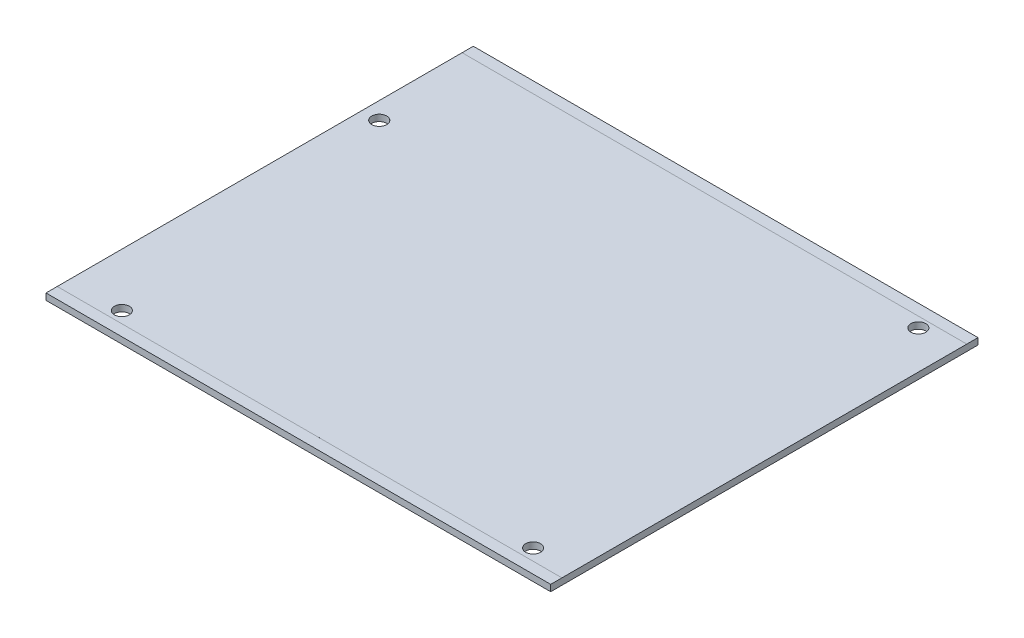
ISO-10303-21;
HEADER;
FILE_DESCRIPTION(('STEP AP214'),'2;1');
FILE_NAME('part.step','',(''),(''),'','','');
FILE_SCHEMA(('AUTOMOTIVE_DESIGN { 1 0 10303 214 1 1 1 1 }'));
ENDSEC;
DATA;
#1=APPLICATION_CONTEXT('core data for automotive mechanical design processes');
#2=APPLICATION_PROTOCOL_DEFINITION('international standard','automotive_design',2000,#1);
#3=PRODUCT_CONTEXT('',#1,'mechanical');
#4=PRODUCT('Part','Part','',(#3));
#5=PRODUCT_RELATED_PRODUCT_CATEGORY('part','',(#4));
#6=PRODUCT_DEFINITION_FORMATION('','',#4);
#7=PRODUCT_DEFINITION_CONTEXT('part definition',#1,'design');
#8=PRODUCT_DEFINITION('design','',#6,#7);
#9=PRODUCT_DEFINITION_SHAPE('','',#8);
#10=(LENGTH_UNIT() NAMED_UNIT(*) SI_UNIT(.MILLI.,.METRE.));
#11=(NAMED_UNIT(*) PLANE_ANGLE_UNIT() SI_UNIT($,.RADIAN.));
#12=(NAMED_UNIT(*) SI_UNIT($,.STERADIAN.) SOLID_ANGLE_UNIT());
#13=UNCERTAINTY_MEASURE_WITH_UNIT(LENGTH_MEASURE(1.E-05),#10,'distance_accuracy_value','');
#14=(GEOMETRIC_REPRESENTATION_CONTEXT(3) GLOBAL_UNCERTAINTY_ASSIGNED_CONTEXT((#13)) GLOBAL_UNIT_ASSIGNED_CONTEXT((#10,
#11,#12)) REPRESENTATION_CONTEXT('',''));
#15=CARTESIAN_POINT('',(0.,0.,0.));
#16=DIRECTION('',(0.,0.,1.));
#17=DIRECTION('',(1.,0.,0.));
#18=AXIS2_PLACEMENT_3D('',#15,#16,#17);
#19=CARTESIAN_POINT('',(-67.5,1.724,-57.15));
#20=DIRECTION('',(0.,0.,1.));
#21=DIRECTION('',(1.,0.,0.));
#22=AXIS2_PLACEMENT_3D('',#19,#20,#21);
#23=PLANE('',#22);
#24=DIRECTION('',(-1.,0.,0.));
#25=VECTOR('',#24,1.);
#26=CARTESIAN_POINT('',(-67.5,1.7239,-57.15));
#27=LINE('',#26,#25);
#28=CARTESIAN_POINT('',(67.5,1.7239,-57.15));
#29=VERTEX_POINT('',#28);
#30=CARTESIAN_POINT('',(-67.5,1.7239,-57.15));
#31=VERTEX_POINT('',#30);
#32=EDGE_CURVE('E140',#29,#31,#27,.T.);
#33=ORIENTED_EDGE('',*,*,#32,.F.);
#34=DIRECTION('',(0.,-1.,0.));
#35=VECTOR('',#34,1.);
#36=CARTESIAN_POINT('',(67.5,1.724,-57.15));
#37=LINE('',#36,#35);
#38=CARTESIAN_POINT('',(67.5,0.,-57.15));
#39=VERTEX_POINT('',#38);
#40=EDGE_CURVE('E11',#29,#39,#37,.T.);
#41=ORIENTED_EDGE('',*,*,#40,.T.);
#42=DIRECTION('',(-1.,0.,0.));
#43=VECTOR('',#42,1.);
#44=CARTESIAN_POINT('',(-67.5,0.,-57.15));
#45=LINE('',#44,#43);
#46=CARTESIAN_POINT('',(-67.5,0.,-57.15));
#47=VERTEX_POINT('',#46);
#48=EDGE_CURVE('E129',#39,#47,#45,.T.);
#49=ORIENTED_EDGE('',*,*,#48,.T.);
#50=DIRECTION('',(0.,-1.,0.));
#51=VECTOR('',#50,1.);
#52=CARTESIAN_POINT('',(-67.5,1.724,-57.15));
#53=LINE('',#52,#51);
#54=EDGE_CURVE('E39',#31,#47,#53,.T.);
#55=ORIENTED_EDGE('',*,*,#54,.F.);
#56=EDGE_LOOP('',(#33,#41,#49,#55));
#57=FACE_BOUND('',#56,.T.);
#58=ADVANCED_FACE('F31',(#57),#23,.F.);
#59=CARTESIAN_POINT('',(67.5,1.724,57.15));
#60=DIRECTION('',(-1.,0.,0.));
#61=DIRECTION('',(0.,0.,1.));
#62=AXIS2_PLACEMENT_3D('',#59,#60,#61);
#63=PLANE('',#62);
#64=DIRECTION('',(0.,0.,-1.));
#65=VECTOR('',#64,1.);
#66=CARTESIAN_POINT('',(67.5,1.724,57.15));
#67=LINE('',#66,#65);
#68=CARTESIAN_POINT('',(67.5,1.724,54.15));
#69=VERTEX_POINT('',#68);
#70=CARTESIAN_POINT('',(67.5,1.724,-54.15));
#71=VERTEX_POINT('',#70);
#72=EDGE_CURVE('E127',#69,#71,#67,.T.);
#73=ORIENTED_EDGE('',*,*,#72,.F.);
#74=DIRECTION('',(0.,1.,0.));
#75=VECTOR('',#74,1.);
#76=CARTESIAN_POINT('',(67.5,1.7239,54.15));
#77=LINE('',#76,#75);
#78=CARTESIAN_POINT('',(67.5,1.7239,54.15));
#79=VERTEX_POINT('',#78);
#80=EDGE_CURVE('E46',#79,#69,#77,.T.);
#81=ORIENTED_EDGE('',*,*,#80,.F.);
#82=DIRECTION('',(0.,0.,-1.));
#83=VECTOR('',#82,1.);
#84=CARTESIAN_POINT('',(67.5,1.7239,57.15));
#85=LINE('',#84,#83);
#86=CARTESIAN_POINT('',(67.5,1.7239,57.15));
#87=VERTEX_POINT('',#86);
#88=EDGE_CURVE('E115',#87,#79,#85,.T.);
#89=ORIENTED_EDGE('',*,*,#88,.F.);
#90=DIRECTION('',(0.,-1.,0.));
#91=VECTOR('',#90,1.);
#92=CARTESIAN_POINT('',(67.5,1.724,57.15));
#93=LINE('',#92,#91);
#94=CARTESIAN_POINT('',(67.5,0.,57.15));
#95=VERTEX_POINT('',#94);
#96=EDGE_CURVE('E114',#87,#95,#93,.T.);
#97=ORIENTED_EDGE('',*,*,#96,.T.);
#98=DIRECTION('',(0.,0.,-1.));
#99=VECTOR('',#98,1.);
#100=CARTESIAN_POINT('',(67.5,0.,57.15));
#101=LINE('',#100,#99);
#102=EDGE_CURVE('E132',#95,#39,#101,.T.);
#103=ORIENTED_EDGE('',*,*,#102,.T.);
#104=ORIENTED_EDGE('',*,*,#40,.F.);
#105=DIRECTION('',(0.,0.,-1.));
#106=VECTOR('',#105,1.);
#107=CARTESIAN_POINT('',(67.5,1.7239,-57.15));
#108=LINE('',#107,#106);
#109=CARTESIAN_POINT('',(67.5,1.7239,-54.15));
#110=VERTEX_POINT('',#109);
#111=EDGE_CURVE('E148',#110,#29,#108,.T.);
#112=ORIENTED_EDGE('',*,*,#111,.F.);
#113=DIRECTION('',(0.,1.,0.));
#114=VECTOR('',#113,1.);
#115=CARTESIAN_POINT('',(67.5,1.7239,-54.15));
#116=LINE('',#115,#114);
#117=EDGE_CURVE('E135',#110,#71,#116,.T.);
#118=ORIENTED_EDGE('',*,*,#117,.T.);
#119=EDGE_LOOP('',(#73,#81,#89,#97,#103,#104,#112,#118));
#120=FACE_BOUND('',#119,.T.);
#121=ADVANCED_FACE('F33',(#120),#63,.F.);
#122=CARTESIAN_POINT('',(-67.5,1.724,57.15));
#123=DIRECTION('',(1.,0.,0.));
#124=DIRECTION('',(0.,0.,-1.));
#125=AXIS2_PLACEMENT_3D('',#122,#123,#124);
#126=PLANE('',#125);
#127=DIRECTION('',(0.,0.,1.));
#128=VECTOR('',#127,1.);
#129=CARTESIAN_POINT('',(-67.5,1.7239,57.15));
#130=LINE('',#129,#128);
#131=CARTESIAN_POINT('',(-67.5,1.7239,54.15));
#132=VERTEX_POINT('',#131);
#133=CARTESIAN_POINT('',(-67.5,1.7239,57.15));
#134=VERTEX_POINT('',#133);
#135=EDGE_CURVE('E97',#132,#134,#130,.T.);
#136=ORIENTED_EDGE('',*,*,#135,.F.);
#137=DIRECTION('',(0.,1.,0.));
#138=VECTOR('',#137,1.);
#139=CARTESIAN_POINT('',(-67.5,1.7239,54.15));
#140=LINE('',#139,#138);
#141=CARTESIAN_POINT('',(-67.5,1.724,54.15));
#142=VERTEX_POINT('',#141);
#143=EDGE_CURVE('E146',#132,#142,#140,.T.);
#144=ORIENTED_EDGE('',*,*,#143,.T.);
#145=DIRECTION('',(0.,0.,1.));
#146=VECTOR('',#145,1.);
#147=CARTESIAN_POINT('',(-67.5,1.724,57.15));
#148=LINE('',#147,#146);
#149=CARTESIAN_POINT('',(-67.5,1.724,-54.15));
#150=VERTEX_POINT('',#149);
#151=EDGE_CURVE('E122',#150,#142,#148,.T.);
#152=ORIENTED_EDGE('',*,*,#151,.F.);
#153=DIRECTION('',(0.,1.,0.));
#154=VECTOR('',#153,1.);
#155=CARTESIAN_POINT('',(-67.5,1.7239,-54.15));
#156=LINE('',#155,#154);
#157=CARTESIAN_POINT('',(-67.5,1.7239,-54.15));
#158=VERTEX_POINT('',#157);
#159=EDGE_CURVE('E54',#158,#150,#156,.T.);
#160=ORIENTED_EDGE('',*,*,#159,.F.);
#161=DIRECTION('',(0.,0.,1.));
#162=VECTOR('',#161,1.);
#163=CARTESIAN_POINT('',(-67.5,1.7239,-57.15));
#164=LINE('',#163,#162);
#165=EDGE_CURVE('E145',#31,#158,#164,.T.);
#166=ORIENTED_EDGE('',*,*,#165,.F.);
#167=ORIENTED_EDGE('',*,*,#54,.T.);
#168=DIRECTION('',(0.,0.,1.));
#169=VECTOR('',#168,1.);
#170=CARTESIAN_POINT('',(-67.5,0.,57.15));
#171=LINE('',#170,#169);
#172=CARTESIAN_POINT('',(-67.5,0.,57.15));
#173=VERTEX_POINT('',#172);
#174=EDGE_CURVE('E119',#47,#173,#171,.T.);
#175=ORIENTED_EDGE('',*,*,#174,.T.);
#176=DIRECTION('',(0.,-1.,0.));
#177=VECTOR('',#176,1.);
#178=CARTESIAN_POINT('',(-67.5,1.724,57.15));
#179=LINE('',#178,#177);
#180=EDGE_CURVE('E112',#134,#173,#179,.T.);
#181=ORIENTED_EDGE('',*,*,#180,.F.);
#182=EDGE_LOOP('',(#136,#144,#152,#160,#166,#167,#175,#181));
#183=FACE_BOUND('',#182,.T.);
#184=ADVANCED_FACE('F117',(#183),#126,.F.);
#185=CARTESIAN_POINT('',(-67.5,1.724,57.15));
#186=DIRECTION('',(0.,0.,-1.));
#187=DIRECTION('',(-1.,0.,0.));
#188=AXIS2_PLACEMENT_3D('',#185,#186,#187);
#189=PLANE('',#188);
#190=ORIENTED_EDGE('',*,*,#96,.F.);
#191=DIRECTION('',(1.,0.,0.));
#192=VECTOR('',#191,1.);
#193=CARTESIAN_POINT('',(-67.5,1.7239,57.15));
#194=LINE('',#193,#192);
#195=EDGE_CURVE('E100',#134,#87,#194,.T.);
#196=ORIENTED_EDGE('',*,*,#195,.F.);
#197=ORIENTED_EDGE('',*,*,#180,.T.);
#198=DIRECTION('',(1.,0.,0.));
#199=VECTOR('',#198,1.);
#200=CARTESIAN_POINT('',(-67.5,0.,57.15));
#201=LINE('',#200,#199);
#202=EDGE_CURVE('E125',#173,#95,#201,.T.);
#203=ORIENTED_EDGE('',*,*,#202,.T.);
#204=EDGE_LOOP('',(#190,#196,#197,#203));
#205=FACE_BOUND('',#204,.T.);
#206=ADVANCED_FACE('F110',(#205),#189,.F.);
#207=CARTESIAN_POINT('',(67.5,1.724,-57.15));
#208=DIRECTION('',(0.,-1.,0.));
#209=DIRECTION('',(0.,0.,-1.));
#210=AXIS2_PLACEMENT_3D('',#207,#208,#209);
#211=PLANE('',#210);
#212=CARTESIAN_POINT('',(-62.9274879110714,1.724,-27.4202383587924));
#213=DIRECTION('',(0.,-1.,0.));
#214=DIRECTION('',(0.,0.,-1.));
#215=AXIS2_PLACEMENT_3D('',#212,#213,#214);
#216=CIRCLE('',#215,2.);
#217=CARTESIAN_POINT('',(-62.9274879110714,1.724,-29.4202383587924));
#218=VERTEX_POINT('',#217);
#219=EDGE_CURVE('E176',#218,#218,#216,.T.);
#220=ORIENTED_EDGE('',*,*,#219,.T.);
#221=EDGE_LOOP('',(#220));
#222=FACE_BOUND('',#221,.T.);
#223=CARTESIAN_POINT('',(57.2725120889286,1.724,-51.4202383587924));
#224=DIRECTION('',(0.,-1.,0.));
#225=DIRECTION('',(0.,0.,-1.));
#226=AXIS2_PLACEMENT_3D('',#223,#224,#225);
#227=CIRCLE('',#226,2.);
#228=CARTESIAN_POINT('',(57.2725120889286,1.724,-53.4202383587924));
#229=VERTEX_POINT('',#228);
#230=EDGE_CURVE('E170',#229,#229,#227,.T.);
#231=ORIENTED_EDGE('',*,*,#230,.T.);
#232=EDGE_LOOP('',(#231));
#233=FACE_BOUND('',#232,.T.);
#234=CARTESIAN_POINT('',(56.7245120889286,1.724,51.0797616412076));
#235=DIRECTION('',(0.,-1.,0.));
#236=DIRECTION('',(0.,0.,-1.));
#237=AXIS2_PLACEMENT_3D('',#234,#235,#236);
#238=CIRCLE('',#237,2.);
#239=CARTESIAN_POINT('',(56.7245120889286,1.724,49.0797616412076));
#240=VERTEX_POINT('',#239);
#241=EDGE_CURVE('E164',#240,#240,#238,.T.);
#242=ORIENTED_EDGE('',*,*,#241,.T.);
#243=EDGE_LOOP('',(#242));
#244=FACE_BOUND('',#243,.T.);
#245=CARTESIAN_POINT('',(-53.2754879110714,1.724,51.0797616412077));
#246=DIRECTION('',(0.,-1.,0.));
#247=DIRECTION('',(0.,0.,-1.));
#248=AXIS2_PLACEMENT_3D('',#245,#246,#247);
#249=CIRCLE('',#248,2.);
#250=CARTESIAN_POINT('',(-53.2754879110714,1.724,49.0797616412077));
#251=VERTEX_POINT('',#250);
#252=EDGE_CURVE('E158',#251,#251,#249,.T.);
#253=ORIENTED_EDGE('',*,*,#252,.T.);
#254=EDGE_LOOP('',(#253));
#255=FACE_BOUND('',#254,.T.);
#256=ORIENTED_EDGE('',*,*,#151,.T.);
#257=DIRECTION('',(-1.,0.,0.));
#258=VECTOR('',#257,1.);
#259=CARTESIAN_POINT('',(-67.5,1.724,54.15));
#260=LINE('',#259,#258);
#261=EDGE_CURVE('E106',#69,#142,#260,.T.);
#262=ORIENTED_EDGE('',*,*,#261,.F.);
#263=ORIENTED_EDGE('',*,*,#72,.T.);
#264=DIRECTION('',(1.,0.,0.));
#265=VECTOR('',#264,1.);
#266=CARTESIAN_POINT('',(-67.5,1.724,-54.15));
#267=LINE('',#266,#265);
#268=EDGE_CURVE('E143',#150,#71,#267,.T.);
#269=ORIENTED_EDGE('',*,*,#268,.F.);
#270=EDGE_LOOP('',(#256,#262,#263,#269));
#271=FACE_BOUND('',#270,.T.);
#272=ADVANCED_FACE('F185',(#222,#233,#244,#255,#271),#211,.F.);
#273=CARTESIAN_POINT('',(67.5,0.,-57.15));
#274=DIRECTION('',(0.,-1.,0.));
#275=DIRECTION('',(0.,0.,-1.));
#276=AXIS2_PLACEMENT_3D('',#273,#274,#275);
#277=PLANE('',#276);
#278=CARTESIAN_POINT('',(-62.9274879110714,0.,-27.4202383587924));
#279=DIRECTION('',(0.,-1.,0.));
#280=DIRECTION('',(0.,0.,-1.));
#281=AXIS2_PLACEMENT_3D('',#278,#279,#280);
#282=CIRCLE('',#281,2.);
#283=CARTESIAN_POINT('',(-62.9274879110714,0.,-29.4202383587924));
#284=VERTEX_POINT('',#283);
#285=EDGE_CURVE('E179',#284,#284,#282,.T.);
#286=ORIENTED_EDGE('',*,*,#285,.F.);
#287=EDGE_LOOP('',(#286));
#288=FACE_BOUND('',#287,.T.);
#289=CARTESIAN_POINT('',(57.2725120889286,0.,-51.4202383587924));
#290=DIRECTION('',(0.,-1.,0.));
#291=DIRECTION('',(0.,0.,-1.));
#292=AXIS2_PLACEMENT_3D('',#289,#290,#291);
#293=CIRCLE('',#292,2.);
#294=CARTESIAN_POINT('',(57.2725120889286,0.,-53.4202383587924));
#295=VERTEX_POINT('',#294);
#296=EDGE_CURVE('E173',#295,#295,#293,.T.);
#297=ORIENTED_EDGE('',*,*,#296,.F.);
#298=EDGE_LOOP('',(#297));
#299=FACE_BOUND('',#298,.T.);
#300=CARTESIAN_POINT('',(56.7245120889286,0.,51.0797616412076));
#301=DIRECTION('',(0.,-1.,0.));
#302=DIRECTION('',(0.,0.,-1.));
#303=AXIS2_PLACEMENT_3D('',#300,#301,#302);
#304=CIRCLE('',#303,2.);
#305=CARTESIAN_POINT('',(56.7245120889286,0.,49.0797616412076));
#306=VERTEX_POINT('',#305);
#307=EDGE_CURVE('E167',#306,#306,#304,.T.);
#308=ORIENTED_EDGE('',*,*,#307,.F.);
#309=EDGE_LOOP('',(#308));
#310=FACE_BOUND('',#309,.T.);
#311=CARTESIAN_POINT('',(-53.2754879110714,0.,51.0797616412077));
#312=DIRECTION('',(0.,-1.,0.));
#313=DIRECTION('',(0.,0.,-1.));
#314=AXIS2_PLACEMENT_3D('',#311,#312,#313);
#315=CIRCLE('',#314,2.);
#316=CARTESIAN_POINT('',(-53.2754879110714,0.,49.0797616412077));
#317=VERTEX_POINT('',#316);
#318=EDGE_CURVE('E161',#317,#317,#315,.T.);
#319=ORIENTED_EDGE('',*,*,#318,.F.);
#320=EDGE_LOOP('',(#319));
#321=FACE_BOUND('',#320,.T.);
#322=ORIENTED_EDGE('',*,*,#102,.F.);
#323=ORIENTED_EDGE('',*,*,#202,.F.);
#324=ORIENTED_EDGE('',*,*,#174,.F.);
#325=ORIENTED_EDGE('',*,*,#48,.F.);
#326=EDGE_LOOP('',(#322,#323,#324,#325));
#327=FACE_BOUND('',#326,.T.);
#328=ADVANCED_FACE('F195',(#288,#299,#310,#321,#327),#277,.T.);
#329=CARTESIAN_POINT('',(-67.5,1.7239,-54.15));
#330=DIRECTION('',(0.,0.,1.));
#331=DIRECTION('',(1.,0.,0.));
#332=AXIS2_PLACEMENT_3D('',#329,#330,#331);
#333=PLANE('',#332);
#334=ORIENTED_EDGE('',*,*,#268,.T.);
#335=ORIENTED_EDGE('',*,*,#117,.F.);
#336=DIRECTION('',(1.,0.,0.));
#337=VECTOR('',#336,1.);
#338=CARTESIAN_POINT('',(-67.5,1.7239,-54.15));
#339=LINE('',#338,#337);
#340=EDGE_CURVE('E150',#158,#110,#339,.T.);
#341=ORIENTED_EDGE('',*,*,#340,.F.);
#342=ORIENTED_EDGE('',*,*,#159,.T.);
#343=EDGE_LOOP('',(#334,#335,#341,#342));
#344=FACE_BOUND('',#343,.T.);
#345=ADVANCED_FACE('F198',(#344),#333,.F.);
#346=CARTESIAN_POINT('',(-67.5,1.7239,-54.15));
#347=DIRECTION('',(0.,1.,0.));
#348=DIRECTION('',(0.,0.,1.));
#349=AXIS2_PLACEMENT_3D('',#346,#347,#348);
#350=PLANE('',#349);
#351=ORIENTED_EDGE('',*,*,#165,.T.);
#352=ORIENTED_EDGE('',*,*,#340,.T.);
#353=ORIENTED_EDGE('',*,*,#111,.T.);
#354=ORIENTED_EDGE('',*,*,#32,.T.);
#355=EDGE_LOOP('',(#351,#352,#353,#354));
#356=FACE_BOUND('',#355,.T.);
#357=ADVANCED_FACE('F217',(#356),#350,.T.);
#358=CARTESIAN_POINT('',(-67.5,1.7239,54.15));
#359=DIRECTION('',(0.,0.,-1.));
#360=DIRECTION('',(-1.,0.,0.));
#361=AXIS2_PLACEMENT_3D('',#358,#359,#360);
#362=PLANE('',#361);
#363=ORIENTED_EDGE('',*,*,#261,.T.);
#364=ORIENTED_EDGE('',*,*,#143,.F.);
#365=DIRECTION('',(-1.,0.,0.));
#366=VECTOR('',#365,1.);
#367=CARTESIAN_POINT('',(-67.5,1.7239,54.15));
#368=LINE('',#367,#366);
#369=EDGE_CURVE('E102',#79,#132,#368,.T.);
#370=ORIENTED_EDGE('',*,*,#369,.F.);
#371=ORIENTED_EDGE('',*,*,#80,.T.);
#372=EDGE_LOOP('',(#363,#364,#370,#371));
#373=FACE_BOUND('',#372,.T.);
#374=ADVANCED_FACE('F212',(#373),#362,.F.);
#375=CARTESIAN_POINT('',(-67.5,1.7239,54.15));
#376=DIRECTION('',(0.,-1.,0.));
#377=DIRECTION('',(0.,0.,-1.));
#378=AXIS2_PLACEMENT_3D('',#375,#376,#377);
#379=PLANE('',#378);
#380=ORIENTED_EDGE('',*,*,#135,.T.);
#381=ORIENTED_EDGE('',*,*,#195,.T.);
#382=ORIENTED_EDGE('',*,*,#88,.T.);
#383=ORIENTED_EDGE('',*,*,#369,.T.);
#384=EDGE_LOOP('',(#380,#381,#382,#383));
#385=FACE_BOUND('',#384,.T.);
#386=ADVANCED_FACE('F99',(#385),#379,.F.);
#387=CARTESIAN_POINT('',(-53.2754879110714,1.724,51.0797616412077));
#388=DIRECTION('',(0.,-1.,0.));
#389=DIRECTION('',(0.,0.,-1.));
#390=AXIS2_PLACEMENT_3D('',#387,#388,#389);
#391=CYLINDRICAL_SURFACE('',#390,2.);
#392=ORIENTED_EDGE('',*,*,#252,.F.);
#393=EDGE_LOOP('',(#392));
#394=FACE_BOUND('',#393,.T.);
#395=ORIENTED_EDGE('',*,*,#318,.T.);
#396=EDGE_LOOP('',(#395));
#397=FACE_BOUND('',#396,.T.);
#398=ADVANCED_FACE('F240',(#394,#397),#391,.F.);
#399=CARTESIAN_POINT('',(56.7245120889286,1.724,51.0797616412076));
#400=DIRECTION('',(0.,-1.,0.));
#401=DIRECTION('',(0.,0.,-1.));
#402=AXIS2_PLACEMENT_3D('',#399,#400,#401);
#403=CYLINDRICAL_SURFACE('',#402,2.);
#404=ORIENTED_EDGE('',*,*,#241,.F.);
#405=EDGE_LOOP('',(#404));
#406=FACE_BOUND('',#405,.T.);
#407=ORIENTED_EDGE('',*,*,#307,.T.);
#408=EDGE_LOOP('',(#407));
#409=FACE_BOUND('',#408,.T.);
#410=ADVANCED_FACE('F243',(#406,#409),#403,.F.);
#411=CARTESIAN_POINT('',(57.2725120889286,1.724,-51.4202383587924));
#412=DIRECTION('',(0.,-1.,0.));
#413=DIRECTION('',(0.,0.,-1.));
#414=AXIS2_PLACEMENT_3D('',#411,#412,#413);
#415=CYLINDRICAL_SURFACE('',#414,2.);
#416=ORIENTED_EDGE('',*,*,#230,.F.);
#417=EDGE_LOOP('',(#416));
#418=FACE_BOUND('',#417,.T.);
#419=ORIENTED_EDGE('',*,*,#296,.T.);
#420=EDGE_LOOP('',(#419));
#421=FACE_BOUND('',#420,.T.);
#422=ADVANCED_FACE('F191',(#418,#421),#415,.F.);
#423=CARTESIAN_POINT('',(-62.9274879110714,1.724,-27.4202383587924));
#424=DIRECTION('',(0.,-1.,0.));
#425=DIRECTION('',(0.,0.,-1.));
#426=AXIS2_PLACEMENT_3D('',#423,#424,#425);
#427=CYLINDRICAL_SURFACE('',#426,2.);
#428=ORIENTED_EDGE('',*,*,#219,.F.);
#429=EDGE_LOOP('',(#428));
#430=FACE_BOUND('',#429,.T.);
#431=ORIENTED_EDGE('',*,*,#285,.T.);
#432=EDGE_LOOP('',(#431));
#433=FACE_BOUND('',#432,.T.);
#434=ADVANCED_FACE('F188',(#430,#433),#427,.F.);
#435=CLOSED_SHELL('',(#58,#121,#184,#206,#272,#328,#345,#357,#374,#386,#398,#410,#422,#434));
#436=MANIFOLD_SOLID_BREP('B2',#435);
#437=ADVANCED_BREP_SHAPE_REPRESENTATION('',(#18,#436),#14);
#438=SHAPE_DEFINITION_REPRESENTATION(#9,#437);
ENDSEC;
END-ISO-10303-21;
